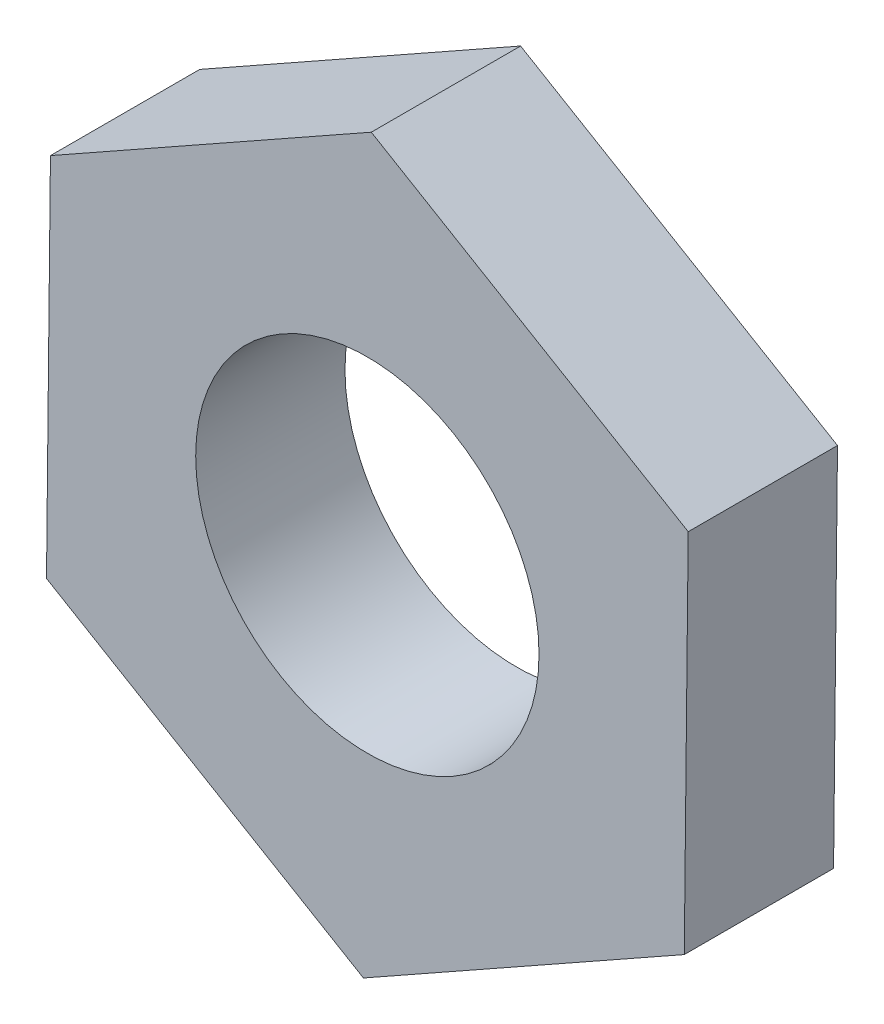
ISO-10303-21;
HEADER;
FILE_DESCRIPTION(('STEP AP214'),'2;1');
FILE_NAME('part.step','',(''),(''),'','','');
FILE_SCHEMA(('AUTOMOTIVE_DESIGN { 1 0 10303 214 1 1 1 1 }'));
ENDSEC;
DATA;
#1=APPLICATION_CONTEXT('core data for automotive mechanical design processes');
#2=APPLICATION_PROTOCOL_DEFINITION('international standard','automotive_design',2000,#1);
#3=PRODUCT_CONTEXT('',#1,'mechanical');
#4=PRODUCT('Part','Part','',(#3));
#5=PRODUCT_RELATED_PRODUCT_CATEGORY('part','',(#4));
#6=PRODUCT_DEFINITION_FORMATION('','',#4);
#7=PRODUCT_DEFINITION_CONTEXT('part definition',#1,'design');
#8=PRODUCT_DEFINITION('design','',#6,#7);
#9=PRODUCT_DEFINITION_SHAPE('','',#8);
#10=(LENGTH_UNIT() NAMED_UNIT(*) SI_UNIT(.MILLI.,.METRE.));
#11=(NAMED_UNIT(*) PLANE_ANGLE_UNIT() SI_UNIT($,.RADIAN.));
#12=(NAMED_UNIT(*) SI_UNIT($,.STERADIAN.) SOLID_ANGLE_UNIT());
#13=UNCERTAINTY_MEASURE_WITH_UNIT(LENGTH_MEASURE(1.E-05),#10,'distance_accuracy_value','');
#14=(GEOMETRIC_REPRESENTATION_CONTEXT(3) GLOBAL_UNCERTAINTY_ASSIGNED_CONTEXT((#13)) GLOBAL_UNIT_ASSIGNED_CONTEXT((#10,
#11,#12)) REPRESENTATION_CONTEXT('',''));
#15=CARTESIAN_POINT('',(0.,0.,0.));
#16=DIRECTION('',(0.,0.,1.));
#17=DIRECTION('',(1.,0.,0.));
#18=AXIS2_PLACEMENT_3D('',#15,#16,#17);
#19=CARTESIAN_POINT('',(0.,0.,3.));
#20=DIRECTION('',(0.,0.,1.));
#21=DIRECTION('',(1.,0.,0.));
#22=AXIS2_PLACEMENT_3D('',#19,#20,#21);
#23=PLANE('',#22);
#24=DIRECTION('',(0.871326589125334,0.490703551121461,0.));
#25=VECTOR('',#24,1.);
#26=CARTESIAN_POINT('',(-0.0791914963754159,-7.39957625184725,3.));
#27=LINE('',#26,#25);
#28=CARTESIAN_POINT('',(-0.0791914963754159,-7.39957625184725,3.));
#29=VERTEX_POINT('',#28);
#30=CARTESIAN_POINT('',(6.36862526315205,-3.76836997354845,3.));
#31=VERTEX_POINT('',#30);
#32=EDGE_CURVE('E140',#29,#31,#27,.T.);
#33=ORIENTED_EDGE('',*,*,#32,.T.);
#34=DIRECTION('',(0.0107015535642461,0.999942736736115,0.));
#35=VECTOR('',#34,1.);
#36=CARTESIAN_POINT('',(6.36862526315205,-3.76836997354845,3.));
#37=LINE('',#36,#35);
#38=CARTESIAN_POINT('',(6.44781675952747,3.63120627829881,3.));
#39=VERTEX_POINT('',#38);
#40=EDGE_CURVE('E97',#31,#39,#37,.T.);
#41=ORIENTED_EDGE('',*,*,#40,.T.);
#42=DIRECTION('',(-0.860625035561087,0.509239185614655,0.));
#43=VECTOR('',#42,1.);
#44=CARTESIAN_POINT('',(6.44781675952747,3.63120627829881,3.));
#45=LINE('',#44,#43);
#46=CARTESIAN_POINT('',(0.0791914963754237,7.39957625184725,3.));
#47=VERTEX_POINT('',#46);
#48=EDGE_CURVE('E110',#39,#47,#45,.T.);
#49=ORIENTED_EDGE('',*,*,#48,.T.);
#50=DIRECTION('',(-0.871326589125334,-0.49070355112146,0.));
#51=VECTOR('',#50,1.);
#52=CARTESIAN_POINT('',(0.0791914963754237,7.39957625184725,3.));
#53=LINE('',#52,#51);
#54=CARTESIAN_POINT('',(-6.36862526315205,3.76836997354845,3.));
#55=VERTEX_POINT('',#54);
#56=EDGE_CURVE('E104',#47,#55,#53,.T.);
#57=ORIENTED_EDGE('',*,*,#56,.T.);
#58=DIRECTION('',(-0.0107015535642462,-0.999942736736115,0.));
#59=VECTOR('',#58,1.);
#60=CARTESIAN_POINT('',(-6.36862526315205,3.76836997354845,3.));
#61=LINE('',#60,#59);
#62=CARTESIAN_POINT('',(-6.44781675952747,-3.6312062782988,3.));
#63=VERTEX_POINT('',#62);
#64=EDGE_CURVE('E108',#55,#63,#61,.T.);
#65=ORIENTED_EDGE('',*,*,#64,.T.);
#66=DIRECTION('',(0.860625035561088,-0.509239185614655,0.));
#67=VECTOR('',#66,1.);
#68=CARTESIAN_POINT('',(-6.44781675952747,-3.6312062782988,3.));
#69=LINE('',#68,#67);
#70=EDGE_CURVE('E60',#63,#29,#69,.T.);
#71=ORIENTED_EDGE('',*,*,#70,.T.);
#72=EDGE_LOOP('',(#33,#41,#49,#57,#65,#71));
#73=FACE_BOUND('',#72,.T.);
#74=CARTESIAN_POINT('',(0.,0.,3.));
#75=DIRECTION('',(0.,0.,1.));
#76=DIRECTION('',(1.,0.,0.));
#77=AXIS2_PLACEMENT_3D('',#74,#75,#76);
#78=CIRCLE('',#77,3.45);
#79=CARTESIAN_POINT('',(3.45,0.,3.));
#80=VERTEX_POINT('',#79);
#81=EDGE_CURVE('E145',#80,#80,#78,.T.);
#82=ORIENTED_EDGE('',*,*,#81,.F.);
#83=EDGE_LOOP('',(#82));
#84=FACE_BOUND('',#83,.T.);
#85=ADVANCED_FACE('F43',(#73,#84),#23,.T.);
#86=CARTESIAN_POINT('',(0.,0.,0.));
#87=DIRECTION('',(0.,0.,1.));
#88=DIRECTION('',(1.,0.,0.));
#89=AXIS2_PLACEMENT_3D('',#86,#87,#88);
#90=PLANE('',#89);
#91=DIRECTION('',(0.871326589125334,0.490703551121461,0.));
#92=VECTOR('',#91,1.);
#93=CARTESIAN_POINT('',(-0.0791914963754159,-7.39957625184725,0.));
#94=LINE('',#93,#92);
#95=CARTESIAN_POINT('',(-0.0791914963754159,-7.39957625184725,0.));
#96=VERTEX_POINT('',#95);
#97=CARTESIAN_POINT('',(6.36862526315205,-3.76836997354845,0.));
#98=VERTEX_POINT('',#97);
#99=EDGE_CURVE('E148',#96,#98,#94,.T.);
#100=ORIENTED_EDGE('',*,*,#99,.F.);
#101=DIRECTION('',(0.860625035561088,-0.509239185614655,0.));
#102=VECTOR('',#101,1.);
#103=CARTESIAN_POINT('',(-6.44781675952747,-3.6312062782988,0.));
#104=LINE('',#103,#102);
#105=CARTESIAN_POINT('',(-6.44781675952747,-3.6312062782988,0.));
#106=VERTEX_POINT('',#105);
#107=EDGE_CURVE('E89',#106,#96,#104,.T.);
#108=ORIENTED_EDGE('',*,*,#107,.F.);
#109=DIRECTION('',(-0.0107015535642462,-0.999942736736115,0.));
#110=VECTOR('',#109,1.);
#111=CARTESIAN_POINT('',(-6.36862526315205,3.76836997354845,0.));
#112=LINE('',#111,#110);
#113=CARTESIAN_POINT('',(-6.36862526315205,3.76836997354845,0.));
#114=VERTEX_POINT('',#113);
#115=EDGE_CURVE('E83',#114,#106,#112,.T.);
#116=ORIENTED_EDGE('',*,*,#115,.F.);
#117=DIRECTION('',(-0.871326589125334,-0.49070355112146,0.));
#118=VECTOR('',#117,1.);
#119=CARTESIAN_POINT('',(0.0791914963754237,7.39957625184725,0.));
#120=LINE('',#119,#118);
#121=CARTESIAN_POINT('',(0.0791914963754237,7.39957625184725,0.));
#122=VERTEX_POINT('',#121);
#123=EDGE_CURVE('E118',#122,#114,#120,.T.);
#124=ORIENTED_EDGE('',*,*,#123,.F.);
#125=DIRECTION('',(-0.860625035561087,0.509239185614655,0.));
#126=VECTOR('',#125,1.);
#127=CARTESIAN_POINT('',(6.44781675952747,3.63120627829881,0.));
#128=LINE('',#127,#126);
#129=CARTESIAN_POINT('',(6.44781675952747,3.63120627829881,0.));
#130=VERTEX_POINT('',#129);
#131=EDGE_CURVE('E156',#130,#122,#128,.T.);
#132=ORIENTED_EDGE('',*,*,#131,.F.);
#133=DIRECTION('',(0.0107015535642461,0.999942736736115,0.));
#134=VECTOR('',#133,1.);
#135=CARTESIAN_POINT('',(6.36862526315205,-3.76836997354845,0.));
#136=LINE('',#135,#134);
#137=EDGE_CURVE('E152',#98,#130,#136,.T.);
#138=ORIENTED_EDGE('',*,*,#137,.F.);
#139=EDGE_LOOP('',(#100,#108,#116,#124,#132,#138));
#140=FACE_BOUND('',#139,.T.);
#141=CARTESIAN_POINT('',(0.,0.,0.));
#142=DIRECTION('',(0.,0.,1.));
#143=DIRECTION('',(1.,0.,0.));
#144=AXIS2_PLACEMENT_3D('',#141,#142,#143);
#145=CIRCLE('',#144,3.45);
#146=CARTESIAN_POINT('',(3.45,0.,0.));
#147=VERTEX_POINT('',#146);
#148=EDGE_CURVE('E143',#147,#147,#145,.T.);
#149=ORIENTED_EDGE('',*,*,#148,.T.);
#150=EDGE_LOOP('',(#149));
#151=FACE_BOUND('',#150,.T.);
#152=ADVANCED_FACE('F170',(#140,#151),#90,.F.);
#153=CARTESIAN_POINT('',(-0.0791914963754159,-7.39957625184725,3.));
#154=DIRECTION('',(-0.49070355112146,0.871326589125334,0.));
#155=DIRECTION('',(-0.871326589125334,-0.490703551121461,0.));
#156=AXIS2_PLACEMENT_3D('',#153,#154,#155);
#157=PLANE('',#156);
#158=ORIENTED_EDGE('',*,*,#99,.T.);
#159=DIRECTION('',(0.,0.,-1.));
#160=VECTOR('',#159,1.);
#161=CARTESIAN_POINT('',(6.36862526315205,-3.76836997354845,3.));
#162=LINE('',#161,#160);
#163=EDGE_CURVE('E12',#31,#98,#162,.T.);
#164=ORIENTED_EDGE('',*,*,#163,.F.);
#165=ORIENTED_EDGE('',*,*,#32,.F.);
#166=DIRECTION('',(0.,0.,-1.));
#167=VECTOR('',#166,1.);
#168=CARTESIAN_POINT('',(-0.0791914963754159,-7.39957625184725,3.));
#169=LINE('',#168,#167);
#170=EDGE_CURVE('E124',#29,#96,#169,.T.);
#171=ORIENTED_EDGE('',*,*,#170,.T.);
#172=EDGE_LOOP('',(#158,#164,#165,#171));
#173=FACE_BOUND('',#172,.T.);
#174=ADVANCED_FACE('F45',(#173),#157,.F.);
#175=CARTESIAN_POINT('',(6.36862526315205,-3.76836997354845,3.));
#176=DIRECTION('',(-0.999942736736115,0.0107015535642461,0.));
#177=DIRECTION('',(-0.0107015535642461,-0.999942736736115,0.));
#178=AXIS2_PLACEMENT_3D('',#175,#176,#177);
#179=PLANE('',#178);
#180=ORIENTED_EDGE('',*,*,#137,.T.);
#181=DIRECTION('',(0.,0.,-1.));
#182=VECTOR('',#181,1.);
#183=CARTESIAN_POINT('',(6.44781675952747,3.63120627829881,3.));
#184=LINE('',#183,#182);
#185=EDGE_CURVE('E52',#39,#130,#184,.T.);
#186=ORIENTED_EDGE('',*,*,#185,.F.);
#187=ORIENTED_EDGE('',*,*,#40,.F.);
#188=ORIENTED_EDGE('',*,*,#163,.T.);
#189=EDGE_LOOP('',(#180,#186,#187,#188));
#190=FACE_BOUND('',#189,.T.);
#191=ADVANCED_FACE('F172',(#190),#179,.F.);
#192=CARTESIAN_POINT('',(6.44781675952747,3.63120627829881,3.));
#193=DIRECTION('',(-0.509239185614655,-0.860625035561088,0.));
#194=DIRECTION('',(0.860625035561088,-0.509239185614655,0.));
#195=AXIS2_PLACEMENT_3D('',#192,#193,#194);
#196=PLANE('',#195);
#197=ORIENTED_EDGE('',*,*,#131,.T.);
#198=DIRECTION('',(0.,0.,-1.));
#199=VECTOR('',#198,1.);
#200=CARTESIAN_POINT('',(0.0791914963754237,7.39957625184725,3.));
#201=LINE('',#200,#199);
#202=EDGE_CURVE('E119',#47,#122,#201,.T.);
#203=ORIENTED_EDGE('',*,*,#202,.F.);
#204=ORIENTED_EDGE('',*,*,#48,.F.);
#205=ORIENTED_EDGE('',*,*,#185,.T.);
#206=EDGE_LOOP('',(#197,#203,#204,#205));
#207=FACE_BOUND('',#206,.T.);
#208=ADVANCED_FACE('F168',(#207),#196,.F.);
#209=CARTESIAN_POINT('',(0.0791914963754237,7.39957625184725,3.));
#210=DIRECTION('',(0.49070355112146,-0.871326589125334,0.));
#211=DIRECTION('',(0.871326589125334,0.49070355112146,0.));
#212=AXIS2_PLACEMENT_3D('',#209,#210,#211);
#213=PLANE('',#212);
#214=ORIENTED_EDGE('',*,*,#123,.T.);
#215=DIRECTION('',(0.,0.,-1.));
#216=VECTOR('',#215,1.);
#217=CARTESIAN_POINT('',(-6.36862526315205,3.76836997354845,3.));
#218=LINE('',#217,#216);
#219=EDGE_CURVE('E115',#55,#114,#218,.T.);
#220=ORIENTED_EDGE('',*,*,#219,.F.);
#221=ORIENTED_EDGE('',*,*,#56,.F.);
#222=ORIENTED_EDGE('',*,*,#202,.T.);
#223=EDGE_LOOP('',(#214,#220,#221,#222));
#224=FACE_BOUND('',#223,.T.);
#225=ADVANCED_FACE('F116',(#224),#213,.F.);
#226=CARTESIAN_POINT('',(-6.36862526315205,3.76836997354845,3.));
#227=DIRECTION('',(0.999942736736115,-0.0107015535642462,0.));
#228=DIRECTION('',(0.0107015535642462,0.999942736736115,0.));
#229=AXIS2_PLACEMENT_3D('',#226,#227,#228);
#230=PLANE('',#229);
#231=ORIENTED_EDGE('',*,*,#115,.T.);
#232=DIRECTION('',(0.,0.,-1.));
#233=VECTOR('',#232,1.);
#234=CARTESIAN_POINT('',(-6.44781675952747,-3.6312062782988,3.));
#235=LINE('',#234,#233);
#236=EDGE_CURVE('E120',#63,#106,#235,.T.);
#237=ORIENTED_EDGE('',*,*,#236,.F.);
#238=ORIENTED_EDGE('',*,*,#64,.F.);
#239=ORIENTED_EDGE('',*,*,#219,.T.);
#240=EDGE_LOOP('',(#231,#237,#238,#239));
#241=FACE_BOUND('',#240,.T.);
#242=ADVANCED_FACE('F122',(#241),#230,.F.);
#243=CARTESIAN_POINT('',(-6.44781675952747,-3.6312062782988,3.));
#244=DIRECTION('',(0.509239185614655,0.860625035561087,0.));
#245=DIRECTION('',(-0.860625035561088,0.509239185614655,0.));
#246=AXIS2_PLACEMENT_3D('',#243,#244,#245);
#247=PLANE('',#246);
#248=ORIENTED_EDGE('',*,*,#107,.T.);
#249=ORIENTED_EDGE('',*,*,#170,.F.);
#250=ORIENTED_EDGE('',*,*,#70,.F.);
#251=ORIENTED_EDGE('',*,*,#236,.T.);
#252=EDGE_LOOP('',(#248,#249,#250,#251));
#253=FACE_BOUND('',#252,.T.);
#254=ADVANCED_FACE('F174',(#253),#247,.F.);
#255=CARTESIAN_POINT('',(0.,0.,3.));
#256=DIRECTION('',(0.,0.,-1.));
#257=DIRECTION('',(-1.,0.,0.));
#258=AXIS2_PLACEMENT_3D('',#255,#256,#257);
#259=CYLINDRICAL_SURFACE('',#258,3.45);
#260=ORIENTED_EDGE('',*,*,#81,.T.);
#261=EDGE_LOOP('',(#260));
#262=FACE_BOUND('',#261,.T.);
#263=ORIENTED_EDGE('',*,*,#148,.F.);
#264=EDGE_LOOP('',(#263));
#265=FACE_BOUND('',#264,.T.);
#266=ADVANCED_FACE('F176',(#262,#265),#259,.F.);
#267=CLOSED_SHELL('',(#85,#152,#174,#191,#208,#225,#242,#254,#266));
#268=MANIFOLD_SOLID_BREP('B2',#267);
#269=ADVANCED_BREP_SHAPE_REPRESENTATION('',(#18,#268),#14);
#270=SHAPE_DEFINITION_REPRESENTATION(#9,#269);
ENDSEC;
END-ISO-10303-21;
